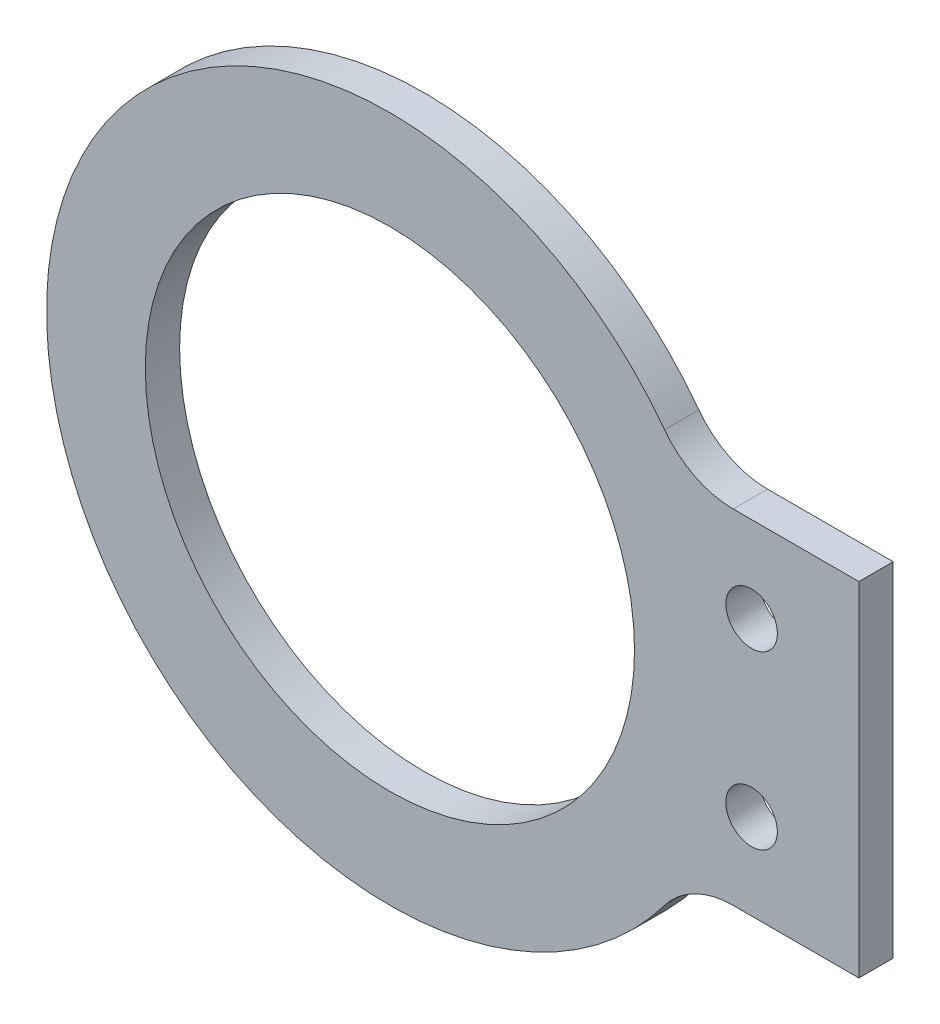
ISO-10303-21;
HEADER;
FILE_DESCRIPTION(('STEP AP214'),'2;1');
FILE_NAME('part.step','',(''),(''),'','','');
FILE_SCHEMA(('AUTOMOTIVE_DESIGN { 1 0 10303 214 1 1 1 1 }'));
ENDSEC;
DATA;
#1=APPLICATION_CONTEXT('core data for automotive mechanical design processes');
#2=APPLICATION_PROTOCOL_DEFINITION('international standard','automotive_design',2000,#1);
#3=PRODUCT_CONTEXT('',#1,'mechanical');
#4=PRODUCT('Part','Part','',(#3));
#5=PRODUCT_RELATED_PRODUCT_CATEGORY('part','',(#4));
#6=PRODUCT_DEFINITION_FORMATION('','',#4);
#7=PRODUCT_DEFINITION_CONTEXT('part definition',#1,'design');
#8=PRODUCT_DEFINITION('design','',#6,#7);
#9=PRODUCT_DEFINITION_SHAPE('','',#8);
#10=(LENGTH_UNIT() NAMED_UNIT(*) SI_UNIT(.MILLI.,.METRE.));
#11=(NAMED_UNIT(*) PLANE_ANGLE_UNIT() SI_UNIT($,.RADIAN.));
#12=(NAMED_UNIT(*) SI_UNIT($,.STERADIAN.) SOLID_ANGLE_UNIT());
#13=UNCERTAINTY_MEASURE_WITH_UNIT(LENGTH_MEASURE(1.E-05),#10,'distance_accuracy_value','');
#14=(GEOMETRIC_REPRESENTATION_CONTEXT(3) GLOBAL_UNCERTAINTY_ASSIGNED_CONTEXT((#13)) GLOBAL_UNIT_ASSIGNED_CONTEXT((#10,
#11,#12)) REPRESENTATION_CONTEXT('',''));
#15=CARTESIAN_POINT('',(0.,0.,0.));
#16=DIRECTION('',(0.,0.,1.));
#17=DIRECTION('',(1.,0.,0.));
#18=AXIS2_PLACEMENT_3D('',#15,#16,#17);
#19=CARTESIAN_POINT('',(40.,-30.,4.));
#20=DIRECTION('',(0.,0.,-1.));
#21=DIRECTION('',(-1.,0.,0.));
#22=AXIS2_PLACEMENT_3D('',#19,#20,#21);
#23=PLANE('',#22);
#24=CARTESIAN_POINT('',(40.,-30.,4.));
#25=DIRECTION('',(0.,0.,-1.));
#26=DIRECTION('',(-1.,0.,0.));
#27=AXIS2_PLACEMENT_3D('',#24,#25,#26);
#28=CIRCLE('',#27,10.);
#29=CARTESIAN_POINT('',(32.,-24.,4.));
#30=VERTEX_POINT('',#29);
#31=CARTESIAN_POINT('',(40.,-20.,4.));
#32=VERTEX_POINT('',#31);
#33=EDGE_CURVE('E132',#30,#32,#28,.T.);
#34=ORIENTED_EDGE('',*,*,#33,.T.);
#35=DIRECTION('',(1.,0.,0.));
#36=VECTOR('',#35,1.);
#37=CARTESIAN_POINT('',(40.,-20.,4.));
#38=LINE('',#37,#36);
#39=CARTESIAN_POINT('',(54.6410161513776,-20.,4.));
#40=VERTEX_POINT('',#39);
#41=EDGE_CURVE('E90',#32,#40,#38,.T.);
#42=ORIENTED_EDGE('',*,*,#41,.T.);
#43=DIRECTION('',(0.,1.,0.));
#44=VECTOR('',#43,1.);
#45=CARTESIAN_POINT('',(54.6410161513775,20.,4.));
#46=LINE('',#45,#44);
#47=CARTESIAN_POINT('',(54.6410161513775,20.,4.));
#48=VERTEX_POINT('',#47);
#49=EDGE_CURVE('E103',#40,#48,#46,.T.);
#50=ORIENTED_EDGE('',*,*,#49,.T.);
#51=DIRECTION('',(-1.,0.,0.));
#52=VECTOR('',#51,1.);
#53=CARTESIAN_POINT('',(40.,20.,4.));
#54=LINE('',#53,#52);
#55=CARTESIAN_POINT('',(40.,20.,4.));
#56=VERTEX_POINT('',#55);
#57=EDGE_CURVE('E97',#48,#56,#54,.T.);
#58=ORIENTED_EDGE('',*,*,#57,.T.);
#59=CARTESIAN_POINT('',(40.,30.,4.));
#60=DIRECTION('',(0.,0.,-1.));
#61=DIRECTION('',(-1.,0.,0.));
#62=AXIS2_PLACEMENT_3D('',#59,#60,#61);
#63=CIRCLE('',#62,10.);
#64=CARTESIAN_POINT('',(32.,24.,4.));
#65=VERTEX_POINT('',#64);
#66=EDGE_CURVE('E101',#56,#65,#63,.T.);
#67=ORIENTED_EDGE('',*,*,#66,.T.);
#68=CARTESIAN_POINT('',(0.,0.,4.));
#69=DIRECTION('',(0.,0.,1.));
#70=DIRECTION('',(1.,0.,0.));
#71=AXIS2_PLACEMENT_3D('',#68,#69,#70);
#72=CIRCLE('',#71,40.);
#73=EDGE_CURVE('E53',#65,#30,#72,.T.);
#74=ORIENTED_EDGE('',*,*,#73,.T.);
#75=EDGE_LOOP('',(#34,#42,#50,#58,#67,#74));
#76=FACE_BOUND('',#75,.T.);
#77=CARTESIAN_POINT('',(0.,0.,4.));
#78=DIRECTION('',(0.,0.,1.));
#79=DIRECTION('',(1.,0.,0.));
#80=AXIS2_PLACEMENT_3D('',#77,#78,#79);
#81=CIRCLE('',#80,28.5);
#82=CARTESIAN_POINT('',(28.5,0.,4.));
#83=VERTEX_POINT('',#82);
#84=EDGE_CURVE('E125',#83,#83,#81,.T.);
#85=ORIENTED_EDGE('',*,*,#84,.F.);
#86=EDGE_LOOP('',(#85));
#87=FACE_BOUND('',#86,.T.);
#88=CARTESIAN_POINT('',(42.1410161513774,10.,4.));
#89=DIRECTION('',(0.,0.,1.));
#90=DIRECTION('',(1.,0.,0.));
#91=AXIS2_PLACEMENT_3D('',#88,#89,#90);
#92=CIRCLE('',#91,3.00000000000001);
#93=CARTESIAN_POINT('',(45.1410161513774,10.,4.));
#94=VERTEX_POINT('',#93);
#95=EDGE_CURVE('E186',#94,#94,#92,.T.);
#96=ORIENTED_EDGE('',*,*,#95,.F.);
#97=EDGE_LOOP('',(#96));
#98=FACE_BOUND('',#97,.T.);
#99=CARTESIAN_POINT('',(42.1410161513774,-10.,4.));
#100=DIRECTION('',(0.,0.,1.));
#101=DIRECTION('',(-1.,0.,0.));
#102=AXIS2_PLACEMENT_3D('',#99,#100,#101);
#103=CIRCLE('',#102,3.00000000000001);
#104=CARTESIAN_POINT('',(39.1410161513774,-10.,4.));
#105=VERTEX_POINT('',#104);
#106=EDGE_CURVE('E177',#105,#105,#103,.T.);
#107=ORIENTED_EDGE('',*,*,#106,.F.);
#108=EDGE_LOOP('',(#107));
#109=FACE_BOUND('',#108,.T.);
#110=ADVANCED_FACE('F36',(#76,#87,#98,#109),#23,.F.);
#111=CARTESIAN_POINT('',(40.,-30.,0.));
#112=DIRECTION('',(0.,0.,-1.));
#113=DIRECTION('',(-1.,0.,0.));
#114=AXIS2_PLACEMENT_3D('',#111,#112,#113);
#115=PLANE('',#114);
#116=CARTESIAN_POINT('',(42.1410161513774,10.,0.));
#117=DIRECTION('',(0.,0.,1.));
#118=DIRECTION('',(1.,0.,0.));
#119=AXIS2_PLACEMENT_3D('',#116,#117,#118);
#120=CIRCLE('',#119,3.00000000000001);
#121=CARTESIAN_POINT('',(45.1410161513774,10.,0.));
#122=VERTEX_POINT('',#121);
#123=EDGE_CURVE('E183',#122,#122,#120,.T.);
#124=ORIENTED_EDGE('',*,*,#123,.T.);
#125=EDGE_LOOP('',(#124));
#126=FACE_BOUND('',#125,.T.);
#127=CARTESIAN_POINT('',(40.,-30.,0.));
#128=DIRECTION('',(0.,0.,-1.));
#129=DIRECTION('',(-1.,0.,0.));
#130=AXIS2_PLACEMENT_3D('',#127,#128,#129);
#131=CIRCLE('',#130,10.);
#132=CARTESIAN_POINT('',(32.,-24.,0.));
#133=VERTEX_POINT('',#132);
#134=CARTESIAN_POINT('',(40.,-20.,0.));
#135=VERTEX_POINT('',#134);
#136=EDGE_CURVE('E121',#133,#135,#131,.T.);
#137=ORIENTED_EDGE('',*,*,#136,.F.);
#138=CARTESIAN_POINT('',(0.,0.,0.));
#139=DIRECTION('',(0.,0.,1.));
#140=DIRECTION('',(1.,0.,0.));
#141=AXIS2_PLACEMENT_3D('',#138,#139,#140);
#142=CIRCLE('',#141,40.);
#143=CARTESIAN_POINT('',(32.,24.,0.));
#144=VERTEX_POINT('',#143);
#145=EDGE_CURVE('E82',#144,#133,#142,.T.);
#146=ORIENTED_EDGE('',*,*,#145,.F.);
#147=CARTESIAN_POINT('',(40.,30.,0.));
#148=DIRECTION('',(0.,0.,-1.));
#149=DIRECTION('',(-1.,0.,0.));
#150=AXIS2_PLACEMENT_3D('',#147,#148,#149);
#151=CIRCLE('',#150,10.);
#152=CARTESIAN_POINT('',(40.,20.,0.));
#153=VERTEX_POINT('',#152);
#154=EDGE_CURVE('E76',#153,#144,#151,.T.);
#155=ORIENTED_EDGE('',*,*,#154,.F.);
#156=DIRECTION('',(-1.,0.,0.));
#157=VECTOR('',#156,1.);
#158=CARTESIAN_POINT('',(40.,20.,0.));
#159=LINE('',#158,#157);
#160=CARTESIAN_POINT('',(54.6410161513775,20.,0.));
#161=VERTEX_POINT('',#160);
#162=EDGE_CURVE('E111',#161,#153,#159,.T.);
#163=ORIENTED_EDGE('',*,*,#162,.F.);
#164=DIRECTION('',(0.,1.,0.));
#165=VECTOR('',#164,1.);
#166=CARTESIAN_POINT('',(54.6410161513775,20.,0.));
#167=LINE('',#166,#165);
#168=CARTESIAN_POINT('',(54.6410161513776,-20.,0.));
#169=VERTEX_POINT('',#168);
#170=EDGE_CURVE('E127',#169,#161,#167,.T.);
#171=ORIENTED_EDGE('',*,*,#170,.F.);
#172=DIRECTION('',(1.,0.,0.));
#173=VECTOR('',#172,1.);
#174=CARTESIAN_POINT('',(40.,-20.,0.));
#175=LINE('',#174,#173);
#176=EDGE_CURVE('E124',#135,#169,#175,.T.);
#177=ORIENTED_EDGE('',*,*,#176,.F.);
#178=EDGE_LOOP('',(#137,#146,#155,#163,#171,#177));
#179=FACE_BOUND('',#178,.T.);
#180=CARTESIAN_POINT('',(0.,0.,0.));
#181=DIRECTION('',(0.,0.,1.));
#182=DIRECTION('',(1.,0.,0.));
#183=AXIS2_PLACEMENT_3D('',#180,#181,#182);
#184=CIRCLE('',#183,28.5);
#185=CARTESIAN_POINT('',(28.5,0.,0.));
#186=VERTEX_POINT('',#185);
#187=EDGE_CURVE('E189',#186,#186,#184,.T.);
#188=ORIENTED_EDGE('',*,*,#187,.T.);
#189=EDGE_LOOP('',(#188));
#190=FACE_BOUND('',#189,.T.);
#191=CARTESIAN_POINT('',(42.1410161513774,-10.,0.));
#192=DIRECTION('',(0.,0.,1.));
#193=DIRECTION('',(-1.,0.,0.));
#194=AXIS2_PLACEMENT_3D('',#191,#192,#193);
#195=CIRCLE('',#194,3.00000000000001);
#196=CARTESIAN_POINT('',(39.1410161513774,-10.,0.));
#197=VERTEX_POINT('',#196);
#198=EDGE_CURVE('E180',#197,#197,#195,.T.);
#199=ORIENTED_EDGE('',*,*,#198,.T.);
#200=EDGE_LOOP('',(#199));
#201=FACE_BOUND('',#200,.T.);
#202=ADVANCED_FACE('F141',(#126,#179,#190,#201),#115,.T.);
#203=CARTESIAN_POINT('',(40.,-30.,4.));
#204=DIRECTION('',(0.,0.,-1.));
#205=DIRECTION('',(-1.,0.,0.));
#206=AXIS2_PLACEMENT_3D('',#203,#204,#205);
#207=CYLINDRICAL_SURFACE('',#206,10.);
#208=ORIENTED_EDGE('',*,*,#136,.T.);
#209=DIRECTION('',(0.,0.,-1.));
#210=VECTOR('',#209,1.);
#211=CARTESIAN_POINT('',(40.,-20.,4.));
#212=LINE('',#211,#210);
#213=EDGE_CURVE('E11',#32,#135,#212,.T.);
#214=ORIENTED_EDGE('',*,*,#213,.F.);
#215=ORIENTED_EDGE('',*,*,#33,.F.);
#216=DIRECTION('',(0.,0.,-1.));
#217=VECTOR('',#216,1.);
#218=CARTESIAN_POINT('',(32.,-24.,4.));
#219=LINE('',#218,#217);
#220=EDGE_CURVE('E117',#30,#133,#219,.T.);
#221=ORIENTED_EDGE('',*,*,#220,.T.);
#222=EDGE_LOOP('',(#208,#214,#215,#221));
#223=FACE_BOUND('',#222,.T.);
#224=ADVANCED_FACE('F38',(#223),#207,.F.);
#225=CARTESIAN_POINT('',(40.,-20.,4.));
#226=DIRECTION('',(0.,1.,0.));
#227=DIRECTION('',(0.,0.,1.));
#228=AXIS2_PLACEMENT_3D('',#225,#226,#227);
#229=PLANE('',#228);
#230=ORIENTED_EDGE('',*,*,#176,.T.);
#231=DIRECTION('',(0.,0.,-1.));
#232=VECTOR('',#231,1.);
#233=CARTESIAN_POINT('',(54.6410161513776,-20.,4.));
#234=LINE('',#233,#232);
#235=EDGE_CURVE('E45',#40,#169,#234,.T.);
#236=ORIENTED_EDGE('',*,*,#235,.F.);
#237=ORIENTED_EDGE('',*,*,#41,.F.);
#238=ORIENTED_EDGE('',*,*,#213,.T.);
#239=EDGE_LOOP('',(#230,#236,#237,#238));
#240=FACE_BOUND('',#239,.T.);
#241=ADVANCED_FACE('F240',(#240),#229,.F.);
#242=CARTESIAN_POINT('',(54.6410161513775,20.,4.));
#243=DIRECTION('',(-1.,0.,0.));
#244=DIRECTION('',(0.,-1.,0.));
#245=AXIS2_PLACEMENT_3D('',#242,#243,#244);
#246=PLANE('',#245);
#247=ORIENTED_EDGE('',*,*,#170,.T.);
#248=DIRECTION('',(0.,0.,-1.));
#249=VECTOR('',#248,1.);
#250=CARTESIAN_POINT('',(54.6410161513775,20.,4.));
#251=LINE('',#250,#249);
#252=EDGE_CURVE('E112',#48,#161,#251,.T.);
#253=ORIENTED_EDGE('',*,*,#252,.F.);
#254=ORIENTED_EDGE('',*,*,#49,.F.);
#255=ORIENTED_EDGE('',*,*,#235,.T.);
#256=EDGE_LOOP('',(#247,#253,#254,#255));
#257=FACE_BOUND('',#256,.T.);
#258=ADVANCED_FACE('F138',(#257),#246,.F.);
#259=CARTESIAN_POINT('',(40.,20.,4.));
#260=DIRECTION('',(0.,-1.,0.));
#261=DIRECTION('',(0.,0.,-1.));
#262=AXIS2_PLACEMENT_3D('',#259,#260,#261);
#263=PLANE('',#262);
#264=ORIENTED_EDGE('',*,*,#162,.T.);
#265=DIRECTION('',(0.,0.,-1.));
#266=VECTOR('',#265,1.);
#267=CARTESIAN_POINT('',(40.,20.,4.));
#268=LINE('',#267,#266);
#269=EDGE_CURVE('E108',#56,#153,#268,.T.);
#270=ORIENTED_EDGE('',*,*,#269,.F.);
#271=ORIENTED_EDGE('',*,*,#57,.F.);
#272=ORIENTED_EDGE('',*,*,#252,.T.);
#273=EDGE_LOOP('',(#264,#270,#271,#272));
#274=FACE_BOUND('',#273,.T.);
#275=ADVANCED_FACE('F109',(#274),#263,.F.);
#276=CARTESIAN_POINT('',(40.,30.,4.));
#277=DIRECTION('',(0.,0.,-1.));
#278=DIRECTION('',(-1.,0.,0.));
#279=AXIS2_PLACEMENT_3D('',#276,#277,#278);
#280=CYLINDRICAL_SURFACE('',#279,10.);
#281=ORIENTED_EDGE('',*,*,#154,.T.);
#282=DIRECTION('',(0.,0.,-1.));
#283=VECTOR('',#282,1.);
#284=CARTESIAN_POINT('',(32.,24.,4.));
#285=LINE('',#284,#283);
#286=EDGE_CURVE('E113',#65,#144,#285,.T.);
#287=ORIENTED_EDGE('',*,*,#286,.F.);
#288=ORIENTED_EDGE('',*,*,#66,.F.);
#289=ORIENTED_EDGE('',*,*,#269,.T.);
#290=EDGE_LOOP('',(#281,#287,#288,#289));
#291=FACE_BOUND('',#290,.T.);
#292=ADVANCED_FACE('F115',(#291),#280,.F.);
#293=CARTESIAN_POINT('',(0.,0.,4.));
#294=DIRECTION('',(0.,0.,-1.));
#295=DIRECTION('',(-1.,0.,0.));
#296=AXIS2_PLACEMENT_3D('',#293,#294,#295);
#297=CYLINDRICAL_SURFACE('',#296,40.);
#298=ORIENTED_EDGE('',*,*,#145,.T.);
#299=ORIENTED_EDGE('',*,*,#220,.F.);
#300=ORIENTED_EDGE('',*,*,#73,.F.);
#301=ORIENTED_EDGE('',*,*,#286,.T.);
#302=EDGE_LOOP('',(#298,#299,#300,#301));
#303=FACE_BOUND('',#302,.T.);
#304=ADVANCED_FACE('F146',(#303),#297,.T.);
#305=CARTESIAN_POINT('',(0.,0.,4.));
#306=DIRECTION('',(0.,0.,-1.));
#307=DIRECTION('',(-1.,0.,0.));
#308=AXIS2_PLACEMENT_3D('',#305,#306,#307);
#309=CYLINDRICAL_SURFACE('',#308,28.5);
#310=ORIENTED_EDGE('',*,*,#84,.T.);
#311=EDGE_LOOP('',(#310));
#312=FACE_BOUND('',#311,.T.);
#313=ORIENTED_EDGE('',*,*,#187,.F.);
#314=EDGE_LOOP('',(#313));
#315=FACE_BOUND('',#314,.T.);
#316=ADVANCED_FACE('F148',(#312,#315),#309,.F.);
#317=CARTESIAN_POINT('',(42.1410161513774,10.,4.));
#318=DIRECTION('',(0.,0.,-1.));
#319=DIRECTION('',(-1.,0.,0.));
#320=AXIS2_PLACEMENT_3D('',#317,#318,#319);
#321=CYLINDRICAL_SURFACE('',#320,3.00000000000001);
#322=ORIENTED_EDGE('',*,*,#95,.T.);
#323=EDGE_LOOP('',(#322));
#324=FACE_BOUND('',#323,.T.);
#325=ORIENTED_EDGE('',*,*,#123,.F.);
#326=EDGE_LOOP('',(#325));
#327=FACE_BOUND('',#326,.T.);
#328=ADVANCED_FACE('F154',(#324,#327),#321,.F.);
#329=CARTESIAN_POINT('',(42.1410161513774,-10.,4.));
#330=DIRECTION('',(0.,0.,-1.));
#331=DIRECTION('',(-1.,0.,0.));
#332=AXIS2_PLACEMENT_3D('',#329,#330,#331);
#333=CYLINDRICAL_SURFACE('',#332,3.00000000000001);
#334=ORIENTED_EDGE('',*,*,#106,.T.);
#335=EDGE_LOOP('',(#334));
#336=FACE_BOUND('',#335,.T.);
#337=ORIENTED_EDGE('',*,*,#198,.F.);
#338=EDGE_LOOP('',(#337));
#339=FACE_BOUND('',#338,.T.);
#340=ADVANCED_FACE('F168',(#336,#339),#333,.F.);
#341=CLOSED_SHELL('',(#110,#202,#224,#241,#258,#275,#292,#304,#316,#328,#340));
#342=MANIFOLD_SOLID_BREP('B2',#341);
#343=ADVANCED_BREP_SHAPE_REPRESENTATION('',(#18,#342),#14);
#344=SHAPE_DEFINITION_REPRESENTATION(#9,#343);
ENDSEC;
END-ISO-10303-21;
